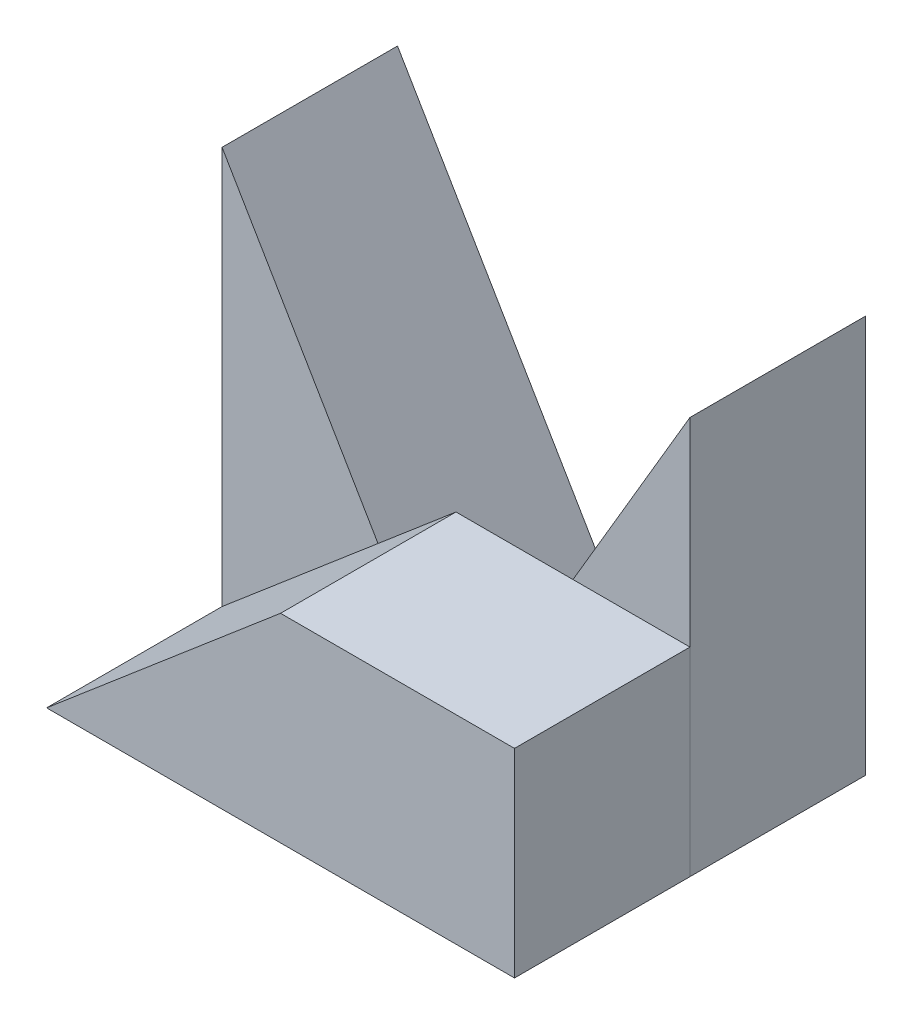
ISO-10303-21;
HEADER;
FILE_DESCRIPTION(('STEP AP214'),'2;1');
FILE_NAME('part.step','',(''),(''),'','','');
FILE_SCHEMA(('AUTOMOTIVE_DESIGN { 1 0 10303 214 1 1 1 1 }'));
ENDSEC;
DATA;
#1=APPLICATION_CONTEXT('core data for automotive mechanical design processes');
#2=APPLICATION_PROTOCOL_DEFINITION('international standard','automotive_design',2000,#1);
#3=PRODUCT_CONTEXT('',#1,'mechanical');
#4=PRODUCT('Part','Part','',(#3));
#5=PRODUCT_RELATED_PRODUCT_CATEGORY('part','',(#4));
#6=PRODUCT_DEFINITION_FORMATION('','',#4);
#7=PRODUCT_DEFINITION_CONTEXT('part definition',#1,'design');
#8=PRODUCT_DEFINITION('design','',#6,#7);
#9=PRODUCT_DEFINITION_SHAPE('','',#8);
#10=(LENGTH_UNIT() NAMED_UNIT(*) SI_UNIT(.MILLI.,.METRE.));
#11=(NAMED_UNIT(*) PLANE_ANGLE_UNIT() SI_UNIT($,.RADIAN.));
#12=(NAMED_UNIT(*) SI_UNIT($,.STERADIAN.) SOLID_ANGLE_UNIT());
#13=UNCERTAINTY_MEASURE_WITH_UNIT(LENGTH_MEASURE(1.E-05),#10,'distance_accuracy_value','');
#14=(GEOMETRIC_REPRESENTATION_CONTEXT(3) GLOBAL_UNCERTAINTY_ASSIGNED_CONTEXT((#13)) GLOBAL_UNIT_ASSIGNED_CONTEXT((#10,
#11,#12)) REPRESENTATION_CONTEXT('',''));
#15=CARTESIAN_POINT('',(0.,0.,0.));
#16=DIRECTION('',(0.,0.,1.));
#17=DIRECTION('',(1.,0.,0.));
#18=AXIS2_PLACEMENT_3D('',#15,#16,#17);
#19=CARTESIAN_POINT('',(-212.265883217049,124.862284245323,-30000.));
#20=DIRECTION('',(-0.861934215157769,0.507020126563394,0.));
#21=DIRECTION('',(-0.507020126563394,-0.86193421515777,0.));
#22=AXIS2_PLACEMENT_3D('',#19,#20,#21);
#23=PLANE('',#22);
#24=DIRECTION('',(-0.507020126563394,-0.86193421515777,0.));
#25=VECTOR('',#24,1.);
#26=CARTESIAN_POINT('',(-212.265883217049,124.862284245323,-15000.));
#27=LINE('',#26,#25);
#28=CARTESIAN_POINT('',(19714.2857142857,34000.,-15000.));
#29=VERTEX_POINT('',#28);
#30=CARTESIAN_POINT('',(-285.714285714295,0.,-15000.));
#31=VERTEX_POINT('',#30);
#32=EDGE_CURVE('E82',#29,#31,#27,.T.);
#33=ORIENTED_EDGE('',*,*,#32,.F.);
#34=DIRECTION('',(0.,0.,1.));
#35=VECTOR('',#34,1.);
#36=CARTESIAN_POINT('',(19714.2857142857,34000.,-30000.));
#37=LINE('',#36,#35);
#38=CARTESIAN_POINT('',(19714.2857142857,34000.,-30000.));
#39=VERTEX_POINT('',#38);
#40=EDGE_CURVE('E12',#39,#29,#37,.T.);
#41=ORIENTED_EDGE('',*,*,#40,.F.);
#42=DIRECTION('',(-0.507020126563394,-0.86193421515777,0.));
#43=VECTOR('',#42,1.);
#44=CARTESIAN_POINT('',(-212.265883217049,124.862284245323,-30000.));
#45=LINE('',#44,#43);
#46=CARTESIAN_POINT('',(-285.714285714295,0.,-30000.));
#47=VERTEX_POINT('',#46);
#48=EDGE_CURVE('E80',#39,#47,#45,.T.);
#49=ORIENTED_EDGE('',*,*,#48,.T.);
#50=DIRECTION('',(0.,0.,1.));
#51=VECTOR('',#50,1.);
#52=CARTESIAN_POINT('',(-285.714285714295,0.,-30000.));
#53=LINE('',#52,#51);
#54=EDGE_CURVE('E78',#47,#31,#53,.T.);
#55=ORIENTED_EDGE('',*,*,#54,.T.);
#56=EDGE_LOOP('',(#33,#41,#49,#55));
#57=FACE_BOUND('',#56,.T.);
#58=ADVANCED_FACE('F45',(#57),#23,.T.);
#59=CARTESIAN_POINT('',(19714.2857142857,0.,-30000.));
#60=DIRECTION('',(1.,0.,0.));
#61=DIRECTION('',(0.,0.,-1.));
#62=AXIS2_PLACEMENT_3D('',#59,#60,#61);
#63=PLANE('',#62);
#64=DIRECTION('',(0.,1.,0.));
#65=VECTOR('',#64,1.);
#66=CARTESIAN_POINT('',(19714.2857142857,0.,-15000.));
#67=LINE('',#66,#65);
#68=CARTESIAN_POINT('',(19714.2857142857,0.,-15000.));
#69=VERTEX_POINT('',#68);
#70=EDGE_CURVE('E96',#69,#29,#67,.T.);
#71=ORIENTED_EDGE('',*,*,#70,.F.);
#72=DIRECTION('',(0.,0.,1.));
#73=VECTOR('',#72,1.);
#74=CARTESIAN_POINT('',(19714.2857142857,0.,-30000.));
#75=LINE('',#74,#73);
#76=CARTESIAN_POINT('',(19714.2857142857,0.,-30000.));
#77=VERTEX_POINT('',#76);
#78=EDGE_CURVE('E53',#77,#69,#75,.T.);
#79=ORIENTED_EDGE('',*,*,#78,.F.);
#80=DIRECTION('',(0.,1.,0.));
#81=VECTOR('',#80,1.);
#82=CARTESIAN_POINT('',(19714.2857142857,0.,-30000.));
#83=LINE('',#82,#81);
#84=EDGE_CURVE('E88',#77,#39,#83,.T.);
#85=ORIENTED_EDGE('',*,*,#84,.T.);
#86=ORIENTED_EDGE('',*,*,#40,.T.);
#87=EDGE_LOOP('',(#71,#79,#85,#86));
#88=FACE_BOUND('',#87,.T.);
#89=ADVANCED_FACE('F91',(#88),#63,.T.);
#90=CARTESIAN_POINT('',(0.,0.,-30000.));
#91=DIRECTION('',(0.,1.,0.));
#92=DIRECTION('',(0.,0.,1.));
#93=AXIS2_PLACEMENT_3D('',#90,#91,#92);
#94=PLANE('',#93);
#95=DIRECTION('',(-1.,0.,0.));
#96=VECTOR('',#95,1.);
#97=CARTESIAN_POINT('',(0.,0.,-15000.));
#98=LINE('',#97,#96);
#99=EDGE_CURVE('E89',#69,#31,#98,.T.);
#100=ORIENTED_EDGE('',*,*,#99,.T.);
#101=ORIENTED_EDGE('',*,*,#54,.F.);
#102=DIRECTION('',(-1.,0.,0.));
#103=VECTOR('',#102,1.);
#104=CARTESIAN_POINT('',(0.,0.,-30000.));
#105=LINE('',#104,#103);
#106=EDGE_CURVE('E61',#77,#47,#105,.T.);
#107=ORIENTED_EDGE('',*,*,#106,.F.);
#108=ORIENTED_EDGE('',*,*,#78,.T.);
#109=EDGE_LOOP('',(#100,#101,#107,#108));
#110=FACE_BOUND('',#109,.T.);
#111=ADVANCED_FACE('F99',(#110),#94,.F.);
#112=CARTESIAN_POINT('',(0.,0.,-30000.));
#113=DIRECTION('',(0.,0.,-1.));
#114=DIRECTION('',(-1.,0.,0.));
#115=AXIS2_PLACEMENT_3D('',#112,#113,#114);
#116=PLANE('',#115);
#117=ORIENTED_EDGE('',*,*,#48,.F.);
#118=ORIENTED_EDGE('',*,*,#84,.F.);
#119=ORIENTED_EDGE('',*,*,#106,.T.);
#120=EDGE_LOOP('',(#117,#118,#119));
#121=FACE_BOUND('',#120,.T.);
#122=ADVANCED_FACE('F87',(#121),#116,.T.);
#123=CARTESIAN_POINT('',(0.,0.,-15000.));
#124=DIRECTION('',(0.,0.,-1.));
#125=DIRECTION('',(-1.,0.,0.));
#126=AXIS2_PLACEMENT_3D('',#123,#124,#125);
#127=PLANE('',#126);
#128=ORIENTED_EDGE('',*,*,#32,.T.);
#129=ORIENTED_EDGE('',*,*,#99,.F.);
#130=ORIENTED_EDGE('',*,*,#70,.T.);
#131=EDGE_LOOP('',(#128,#129,#130));
#132=FACE_BOUND('',#131,.T.);
#133=ADVANCED_FACE('F101',(#132),#127,.F.);
#134=CLOSED_SHELL('',(#58,#89,#111,#122,#133));
#135=MANIFOLD_SOLID_BREP('B2',#134);
#136=CARTESIAN_POINT('',(0.,0.,-15000.));
#137=DIRECTION('',(0.,0.,1.));
#138=DIRECTION('',(1.,0.,0.));
#139=AXIS2_PLACEMENT_3D('',#136,#137,#138);
#140=PLANE('',#139);
#141=DIRECTION('',(0.507020126563394,-0.861934215157769,0.));
#142=VECTOR('',#141,1.);
#143=CARTESIAN_POINT('',(-20285.7142857143,34000.,-15000.));
#144=LINE('',#143,#142);
#145=CARTESIAN_POINT('',(-6952.38095238097,11333.3333333333,-15000.));
#146=VERTEX_POINT('',#145);
#147=CARTESIAN_POINT('',(-285.714285714295,0.,-15000.));
#148=VERTEX_POINT('',#147);
#149=EDGE_CURVE('E43',#146,#148,#144,.T.);
#150=ORIENTED_EDGE('',*,*,#149,.F.);
#151=DIRECTION('',(-0.761939317759459,-0.64764842009554,0.));
#152=VECTOR('',#151,1.);
#153=CARTESIAN_POINT('',(-285.714285714299,17000.,-15000.));
#154=LINE('',#153,#152);
#155=CARTESIAN_POINT('',(-285.714285714299,17000.,-15000.));
#156=VERTEX_POINT('',#155);
#157=EDGE_CURVE('E258',#156,#146,#154,.T.);
#158=ORIENTED_EDGE('',*,*,#157,.F.);
#159=DIRECTION('',(-1.,0.,0.));
#160=VECTOR('',#159,1.);
#161=CARTESIAN_POINT('',(19714.2857142857,17000.,-15000.));
#162=LINE('',#161,#160);
#163=CARTESIAN_POINT('',(19714.2857142857,17000.,-15000.));
#164=VERTEX_POINT('',#163);
#165=EDGE_CURVE('E254',#164,#156,#162,.T.);
#166=ORIENTED_EDGE('',*,*,#165,.F.);
#167=DIRECTION('',(0.,1.,0.));
#168=VECTOR('',#167,1.);
#169=CARTESIAN_POINT('',(19714.2857142857,0.,-15000.));
#170=LINE('',#169,#168);
#171=CARTESIAN_POINT('',(19714.2857142857,0.,-15000.));
#172=VERTEX_POINT('',#171);
#173=EDGE_CURVE('E251',#172,#164,#170,.T.);
#174=ORIENTED_EDGE('',*,*,#173,.F.);
#175=DIRECTION('',(1.,0.,0.));
#176=VECTOR('',#175,1.);
#177=CARTESIAN_POINT('',(-20285.7142857143,0.,-15000.));
#178=LINE('',#177,#176);
#179=EDGE_CURVE('E179',#148,#172,#178,.T.);
#180=ORIENTED_EDGE('',*,*,#179,.F.);
#181=EDGE_LOOP('',(#150,#158,#166,#174,#180));
#182=FACE_BOUND('',#181,.T.);
#183=ADVANCED_FACE('F155',(#182),#140,.F.);
#184=CARTESIAN_POINT('',(19714.2857142857,0.,-15000.));
#185=DIRECTION('',(1.,0.,0.));
#186=DIRECTION('',(0.,0.,-1.));
#187=AXIS2_PLACEMENT_3D('',#184,#185,#186);
#188=PLANE('',#187);
#189=DIRECTION('',(0.,1.,0.));
#190=VECTOR('',#189,1.);
#191=CARTESIAN_POINT('',(19714.2857142857,0.,0.));
#192=LINE('',#191,#190);
#193=CARTESIAN_POINT('',(19714.2857142857,0.,0.));
#194=VERTEX_POINT('',#193);
#195=CARTESIAN_POINT('',(19714.2857142857,17000.,0.));
#196=VERTEX_POINT('',#195);
#197=EDGE_CURVE('E242',#194,#196,#192,.T.);
#198=ORIENTED_EDGE('',*,*,#197,.F.);
#199=DIRECTION('',(0.,0.,1.));
#200=VECTOR('',#199,1.);
#201=CARTESIAN_POINT('',(19714.2857142857,0.,-15000.));
#202=LINE('',#201,#200);
#203=EDGE_CURVE('E164',#172,#194,#202,.T.);
#204=ORIENTED_EDGE('',*,*,#203,.F.);
#205=ORIENTED_EDGE('',*,*,#173,.T.);
#206=DIRECTION('',(0.,0.,1.));
#207=VECTOR('',#206,1.);
#208=CARTESIAN_POINT('',(19714.2857142857,17000.,-15000.));
#209=LINE('',#208,#207);
#210=EDGE_CURVE('E159',#164,#196,#209,.T.);
#211=ORIENTED_EDGE('',*,*,#210,.T.);
#212=EDGE_LOOP('',(#198,#204,#205,#211));
#213=FACE_BOUND('',#212,.T.);
#214=ADVANCED_FACE('F157',(#213),#188,.T.);
#215=CARTESIAN_POINT('',(-20285.7142857143,0.,-15000.));
#216=DIRECTION('',(0.,-1.,0.));
#217=DIRECTION('',(0.,0.,-1.));
#218=AXIS2_PLACEMENT_3D('',#215,#216,#217);
#219=PLANE('',#218);
#220=DIRECTION('',(1.,0.,0.));
#221=VECTOR('',#220,1.);
#222=CARTESIAN_POINT('',(-20285.7142857143,0.,0.));
#223=LINE('',#222,#221);
#224=CARTESIAN_POINT('',(-20285.7142857143,0.,0.));
#225=VERTEX_POINT('',#224);
#226=EDGE_CURVE('E255',#225,#194,#223,.T.);
#227=ORIENTED_EDGE('',*,*,#226,.F.);
#228=DIRECTION('',(0.,0.,1.));
#229=VECTOR('',#228,1.);
#230=CARTESIAN_POINT('',(-20285.7142857143,0.,-15000.));
#231=LINE('',#230,#229);
#232=CARTESIAN_POINT('',(-20285.7142857143,0.,-15000.));
#233=VERTEX_POINT('',#232);
#234=EDGE_CURVE('E269',#233,#225,#231,.T.);
#235=ORIENTED_EDGE('',*,*,#234,.F.);
#236=DIRECTION('',(0.,0.,1.));
#237=VECTOR('',#236,1.);
#238=CARTESIAN_POINT('',(-20285.7142857143,0.,-30000.));
#239=LINE('',#238,#237);
#240=CARTESIAN_POINT('',(-20285.7142857143,0.,-30000.));
#241=VERTEX_POINT('',#240);
#242=EDGE_CURVE('E227',#241,#233,#239,.T.);
#243=ORIENTED_EDGE('',*,*,#242,.F.);
#244=DIRECTION('',(-1.,0.,0.));
#245=VECTOR('',#244,1.);
#246=CARTESIAN_POINT('',(-285.714285714295,0.,-30000.));
#247=LINE('',#246,#245);
#248=CARTESIAN_POINT('',(-285.714285714295,0.,-30000.));
#249=VERTEX_POINT('',#248);
#250=EDGE_CURVE('E220',#249,#241,#247,.T.);
#251=ORIENTED_EDGE('',*,*,#250,.F.);
#252=DIRECTION('',(0.,0.,1.));
#253=VECTOR('',#252,1.);
#254=CARTESIAN_POINT('',(-285.714285714295,0.,-30000.));
#255=LINE('',#254,#253);
#256=EDGE_CURVE('E224',#249,#148,#255,.T.);
#257=ORIENTED_EDGE('',*,*,#256,.T.);
#258=ORIENTED_EDGE('',*,*,#179,.T.);
#259=ORIENTED_EDGE('',*,*,#203,.T.);
#260=EDGE_LOOP('',(#227,#235,#243,#251,#257,#258,#259));
#261=FACE_BOUND('',#260,.T.);
#262=ADVANCED_FACE('F222',(#261),#219,.T.);
#263=CARTESIAN_POINT('',(-285.714285714299,17000.,-15000.));
#264=DIRECTION('',(-0.64764842009554,0.761939317759459,0.));
#265=DIRECTION('',(-0.761939317759459,-0.64764842009554,0.));
#266=AXIS2_PLACEMENT_3D('',#263,#264,#265);
#267=PLANE('',#266);
#268=DIRECTION('',(-0.761939317759459,-0.64764842009554,0.));
#269=VECTOR('',#268,1.);
#270=CARTESIAN_POINT('',(-285.714285714299,17000.,0.));
#271=LINE('',#270,#269);
#272=CARTESIAN_POINT('',(-285.714285714299,17000.,0.));
#273=VERTEX_POINT('',#272);
#274=EDGE_CURVE('E263',#273,#225,#271,.T.);
#275=ORIENTED_EDGE('',*,*,#274,.F.);
#276=DIRECTION('',(0.,0.,1.));
#277=VECTOR('',#276,1.);
#278=CARTESIAN_POINT('',(-285.714285714299,17000.,-15000.));
#279=LINE('',#278,#277);
#280=EDGE_CURVE('E270',#156,#273,#279,.T.);
#281=ORIENTED_EDGE('',*,*,#280,.F.);
#282=ORIENTED_EDGE('',*,*,#157,.T.);
#283=EDGE_CURVE('E257',#146,#233,#154,.T.);
#284=ORIENTED_EDGE('',*,*,#283,.T.);
#285=ORIENTED_EDGE('',*,*,#234,.T.);
#286=EDGE_LOOP('',(#275,#281,#282,#284,#285));
#287=FACE_BOUND('',#286,.T.);
#288=ADVANCED_FACE('F287',(#287),#267,.T.);
#289=CARTESIAN_POINT('',(19714.2857142857,17000.,-15000.));
#290=DIRECTION('',(0.,1.,0.));
#291=DIRECTION('',(-1.,0.,0.));
#292=AXIS2_PLACEMENT_3D('',#289,#290,#291);
#293=PLANE('',#292);
#294=DIRECTION('',(-1.,0.,0.));
#295=VECTOR('',#294,1.);
#296=CARTESIAN_POINT('',(19714.2857142857,17000.,0.));
#297=LINE('',#296,#295);
#298=EDGE_CURVE('E245',#196,#273,#297,.T.);
#299=ORIENTED_EDGE('',*,*,#298,.F.);
#300=ORIENTED_EDGE('',*,*,#210,.F.);
#301=ORIENTED_EDGE('',*,*,#165,.T.);
#302=ORIENTED_EDGE('',*,*,#280,.T.);
#303=EDGE_LOOP('',(#299,#300,#301,#302));
#304=FACE_BOUND('',#303,.T.);
#305=ADVANCED_FACE('F274',(#304),#293,.T.);
#306=CARTESIAN_POINT('',(0.,0.,0.));
#307=DIRECTION('',(0.,0.,1.));
#308=DIRECTION('',(1.,0.,0.));
#309=AXIS2_PLACEMENT_3D('',#306,#307,#308);
#310=PLANE('',#309);
#311=ORIENTED_EDGE('',*,*,#197,.T.);
#312=ORIENTED_EDGE('',*,*,#298,.T.);
#313=ORIENTED_EDGE('',*,*,#274,.T.);
#314=ORIENTED_EDGE('',*,*,#226,.T.);
#315=EDGE_LOOP('',(#311,#312,#313,#314));
#316=FACE_BOUND('',#315,.T.);
#317=ADVANCED_FACE('F276',(#316),#310,.T.);
#318=CARTESIAN_POINT('',(-20285.7142857143,34000.,-30000.));
#319=DIRECTION('',(-0.861934215157769,-0.507020126563394,0.));
#320=DIRECTION('',(0.507020126563394,-0.86193421515777,0.));
#321=AXIS2_PLACEMENT_3D('',#318,#319,#320);
#322=PLANE('',#321);
#323=CARTESIAN_POINT('',(-20285.7142857143,34000.,-15000.));
#324=VERTEX_POINT('',#323);
#325=EDGE_CURVE('E166',#324,#146,#144,.T.);
#326=ORIENTED_EDGE('',*,*,#325,.T.);
#327=ORIENTED_EDGE('',*,*,#149,.T.);
#328=ORIENTED_EDGE('',*,*,#256,.F.);
#329=DIRECTION('',(0.507020126563394,-0.861934215157769,0.));
#330=VECTOR('',#329,1.);
#331=CARTESIAN_POINT('',(-20285.7142857143,34000.,-30000.));
#332=LINE('',#331,#330);
#333=CARTESIAN_POINT('',(-20285.7142857143,34000.,-30000.));
#334=VERTEX_POINT('',#333);
#335=EDGE_CURVE('E231',#334,#249,#332,.T.);
#336=ORIENTED_EDGE('',*,*,#335,.F.);
#337=DIRECTION('',(0.,0.,1.));
#338=VECTOR('',#337,1.);
#339=CARTESIAN_POINT('',(-20285.7142857143,34000.,-30000.));
#340=LINE('',#339,#338);
#341=EDGE_CURVE('E247',#334,#324,#340,.T.);
#342=ORIENTED_EDGE('',*,*,#341,.T.);
#343=EDGE_LOOP('',(#326,#327,#328,#336,#342));
#344=FACE_BOUND('',#343,.T.);
#345=ADVANCED_FACE('F241',(#344),#322,.F.);
#346=CARTESIAN_POINT('',(-20285.7142857143,0.,-30000.));
#347=DIRECTION('',(1.,0.,0.));
#348=DIRECTION('',(0.,0.,-1.));
#349=AXIS2_PLACEMENT_3D('',#346,#347,#348);
#350=PLANE('',#349);
#351=DIRECTION('',(0.,1.,0.));
#352=VECTOR('',#351,1.);
#353=CARTESIAN_POINT('',(-20285.7142857143,0.,-15000.));
#354=LINE('',#353,#352);
#355=EDGE_CURVE('E238',#233,#324,#354,.T.);
#356=ORIENTED_EDGE('',*,*,#355,.T.);
#357=ORIENTED_EDGE('',*,*,#341,.F.);
#358=DIRECTION('',(0.,1.,0.));
#359=VECTOR('',#358,1.);
#360=CARTESIAN_POINT('',(-20285.7142857143,0.,-30000.));
#361=LINE('',#360,#359);
#362=EDGE_CURVE('E230',#241,#334,#361,.T.);
#363=ORIENTED_EDGE('',*,*,#362,.F.);
#364=ORIENTED_EDGE('',*,*,#242,.T.);
#365=EDGE_LOOP('',(#356,#357,#363,#364));
#366=FACE_BOUND('',#365,.T.);
#367=ADVANCED_FACE('F280',(#366),#350,.F.);
#368=CARTESIAN_POINT('',(0.,0.,-30000.));
#369=DIRECTION('',(0.,0.,-1.));
#370=DIRECTION('',(-1.,0.,0.));
#371=AXIS2_PLACEMENT_3D('',#368,#369,#370);
#372=PLANE('',#371);
#373=ORIENTED_EDGE('',*,*,#335,.T.);
#374=ORIENTED_EDGE('',*,*,#250,.T.);
#375=ORIENTED_EDGE('',*,*,#362,.T.);
#376=EDGE_LOOP('',(#373,#374,#375));
#377=FACE_BOUND('',#376,.T.);
#378=ADVANCED_FACE('F234',(#377),#372,.T.);
#379=CARTESIAN_POINT('',(0.,0.,-15000.));
#380=DIRECTION('',(0.,0.,-1.));
#381=DIRECTION('',(-1.,0.,0.));
#382=AXIS2_PLACEMENT_3D('',#379,#380,#381);
#383=PLANE('',#382);
#384=ORIENTED_EDGE('',*,*,#283,.F.);
#385=ORIENTED_EDGE('',*,*,#325,.F.);
#386=ORIENTED_EDGE('',*,*,#355,.F.);
#387=EDGE_LOOP('',(#384,#385,#386));
#388=FACE_BOUND('',#387,.T.);
#389=ADVANCED_FACE('F284',(#388),#383,.F.);
#390=CLOSED_SHELL('',(#183,#214,#262,#288,#305,#317,#345,#367,#378,#389));
#391=MANIFOLD_SOLID_BREP('B6',#390);
#392=ADVANCED_BREP_SHAPE_REPRESENTATION('',(#18,#135,#391),#14);
#393=SHAPE_DEFINITION_REPRESENTATION(#9,#392);
ENDSEC;
END-ISO-10303-21;
